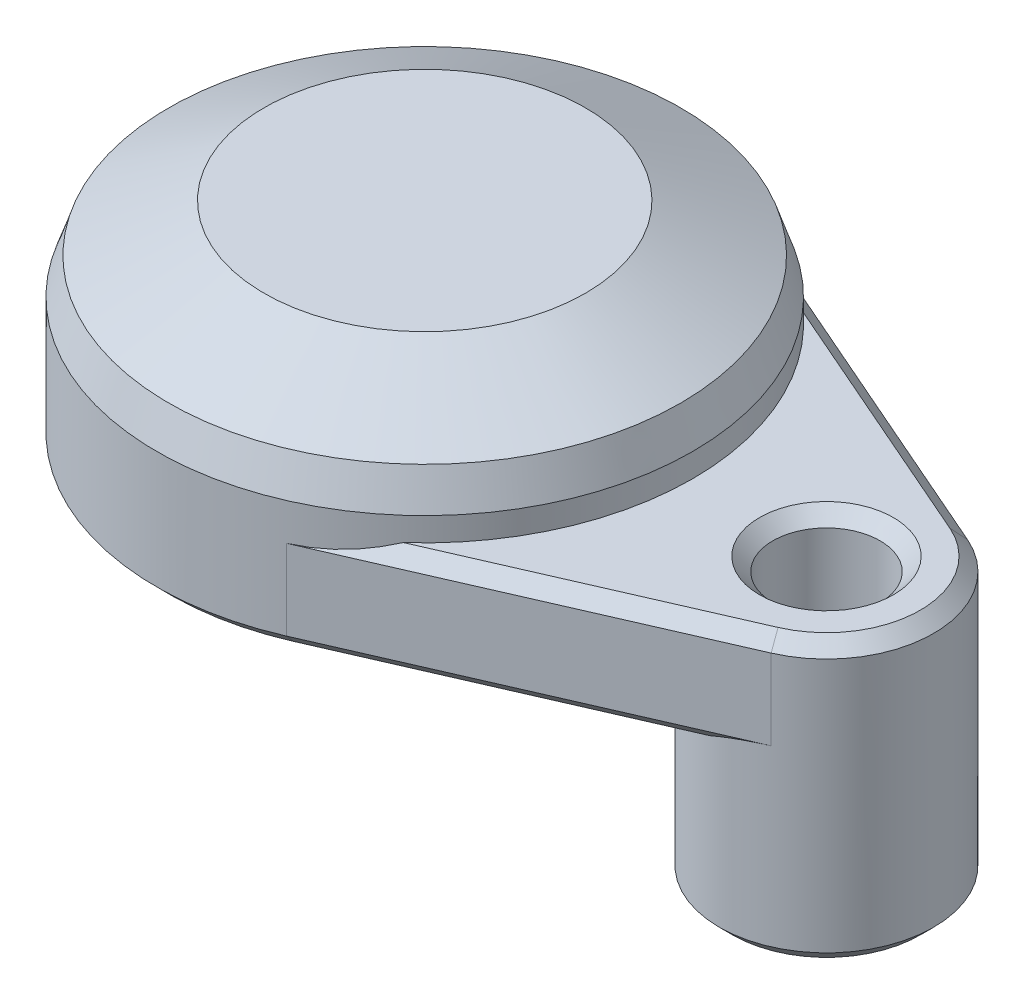
ISO-10303-21;
HEADER;
FILE_DESCRIPTION(('STEP AP214'),'2;1');
FILE_NAME('part.step','',(''),(''),'','','');
FILE_SCHEMA(('AUTOMOTIVE_DESIGN { 1 0 10303 214 1 1 1 1 }'));
ENDSEC;
DATA;
#1=APPLICATION_CONTEXT('core data for automotive mechanical design processes');
#2=APPLICATION_PROTOCOL_DEFINITION('international standard','automotive_design',2000,#1);
#3=PRODUCT_CONTEXT('',#1,'mechanical');
#4=PRODUCT('Part','Part','',(#3));
#5=PRODUCT_RELATED_PRODUCT_CATEGORY('part','',(#4));
#6=PRODUCT_DEFINITION_FORMATION('','',#4);
#7=PRODUCT_DEFINITION_CONTEXT('part definition',#1,'design');
#8=PRODUCT_DEFINITION('design','',#6,#7);
#9=PRODUCT_DEFINITION_SHAPE('','',#8);
#10=(LENGTH_UNIT() NAMED_UNIT(*) SI_UNIT(.MILLI.,.METRE.));
#11=(NAMED_UNIT(*) PLANE_ANGLE_UNIT() SI_UNIT($,.RADIAN.));
#12=(NAMED_UNIT(*) SI_UNIT($,.STERADIAN.) SOLID_ANGLE_UNIT());
#13=UNCERTAINTY_MEASURE_WITH_UNIT(LENGTH_MEASURE(1.E-05),#10,'distance_accuracy_value','');
#14=(GEOMETRIC_REPRESENTATION_CONTEXT(3) GLOBAL_UNCERTAINTY_ASSIGNED_CONTEXT((#13)) GLOBAL_UNIT_ASSIGNED_CONTEXT((#10,
#11,#12)) REPRESENTATION_CONTEXT('',''));
#15=CARTESIAN_POINT('',(0.,0.,0.));
#16=DIRECTION('',(0.,0.,1.));
#17=DIRECTION('',(1.,0.,0.));
#18=AXIS2_PLACEMENT_3D('',#15,#16,#17);
#19=CARTESIAN_POINT('',(0.,2.,0.));
#20=DIRECTION('',(0.,-1.,0.));
#21=DIRECTION('',(0.,0.,-1.));
#22=AXIS2_PLACEMENT_3D('',#19,#20,#21);
#23=CYLINDRICAL_SURFACE('',#22,5.);
#24=CARTESIAN_POINT('',(0.,2.44098300562486,0.));
#25=DIRECTION('',(0.,1.,0.));
#26=DIRECTION('',(-1.,0.,0.));
#27=AXIS2_PLACEMENT_3D('',#24,#25,#26);
#28=CIRCLE('',#27,5.);
#29=CARTESIAN_POINT('',(-5.,2.44098300562484,0.));
#30=VERTEX_POINT('',#29);
#31=EDGE_CURVE('E125',#30,#30,#28,.F.);
#32=ORIENTED_EDGE('',*,*,#31,.T.);
#33=EDGE_LOOP('',(#32));
#34=FACE_BOUND('',#33,.T.);
#35=CARTESIAN_POINT('',(0.,2.,0.));
#36=DIRECTION('',(0.,-1.,0.));
#37=DIRECTION('',(1.,0.,0.));
#38=AXIS2_PLACEMENT_3D('',#35,#36,#37);
#39=CIRCLE('',#38,5.00000000000001);
#40=CARTESIAN_POINT('',(3.33090880212542,2.00000000000001,-3.72894711036821));
#41=VERTEX_POINT('',#40);
#42=CARTESIAN_POINT('',(3.33090880212543,2.00000000000001,3.7289471103682));
#43=VERTEX_POINT('',#42);
#44=EDGE_CURVE('E126',#41,#43,#39,.T.);
#45=ORIENTED_EDGE('',*,*,#44,.F.);
#46=CARTESIAN_POINT('',(0.,6.75000000000002,0.));
#47=DIRECTION('',(0.282842712474619,0.707106781186546,-0.648074069840787));
#48=DIRECTION('',(0.282842712474618,-0.707106781186549,-0.648074069840785));
#49=AXIS2_PLACEMENT_3D('',#46,#47,#48);
#50=ELLIPSE('',#49,7.07106781186549,5.);
#51=CARTESIAN_POINT('',(2.,1.75,-4.58257569495584));
#52=VERTEX_POINT('',#51);
#53=EDGE_CURVE('E11',#41,#52,#50,.T.);
#54=ORIENTED_EDGE('',*,*,#53,.T.);
#55=DIRECTION('',(0.,-1.,0.));
#56=VECTOR('',#55,1.);
#57=CARTESIAN_POINT('',(2.,2.,-4.58257569495584));
#58=LINE('',#57,#56);
#59=CARTESIAN_POINT('',(2.,0.250000000000004,-4.58257569495584));
#60=VERTEX_POINT('',#59);
#61=EDGE_CURVE('E119',#52,#60,#58,.T.);
#62=ORIENTED_EDGE('',*,*,#61,.T.);
#63=CARTESIAN_POINT('',(0.,0.250000000000004,0.));
#64=DIRECTION('',(0.,1.,0.));
#65=DIRECTION('',(0.,0.,1.));
#66=AXIS2_PLACEMENT_3D('',#63,#64,#65);
#67=CIRCLE('',#66,5.);
#68=CARTESIAN_POINT('',(2.,0.250000000000004,4.58257569495584));
#69=VERTEX_POINT('',#68);
#70=EDGE_CURVE('E118',#60,#69,#67,.T.);
#71=ORIENTED_EDGE('',*,*,#70,.T.);
#72=DIRECTION('',(0.,-1.,0.));
#73=VECTOR('',#72,1.);
#74=CARTESIAN_POINT('',(2.,2.,4.58257569495584));
#75=LINE('',#74,#73);
#76=CARTESIAN_POINT('',(2.,1.75,4.58257569495584));
#77=VERTEX_POINT('',#76);
#78=EDGE_CURVE('E107',#77,#69,#75,.T.);
#79=ORIENTED_EDGE('',*,*,#78,.F.);
#80=CARTESIAN_POINT('',(0.,6.75,0.));
#81=DIRECTION('',(0.282842712474619,0.707106781186547,0.648074069840786));
#82=DIRECTION('',(0.282842712474619,-0.707106781186548,0.648074069840786));
#83=AXIS2_PLACEMENT_3D('',#80,#81,#82);
#84=ELLIPSE('',#83,7.07106781186547,5.);
#85=EDGE_CURVE('E51',#77,#43,#84,.T.);
#86=ORIENTED_EDGE('',*,*,#85,.T.);
#87=EDGE_LOOP('',(#45,#54,#62,#71,#79,#86));
#88=FACE_BOUND('',#87,.T.);
#89=ADVANCED_FACE('F41',(#34,#88),#23,.T.);
#90=CARTESIAN_POINT('',(2.,2.,4.58257569495584));
#91=DIRECTION('',(-0.4,0.,-0.916515138991168));
#92=DIRECTION('',(-0.916515138991168,0.,0.4));
#93=AXIS2_PLACEMENT_3D('',#90,#91,#92);
#94=PLANE('',#93);
#95=DIRECTION('',(0.,-1.,0.));
#96=VECTOR('',#95,1.);
#97=CARTESIAN_POINT('',(8.3,2.,1.83303027798234));
#98=LINE('',#97,#96);
#99=CARTESIAN_POINT('',(8.3,1.75,1.83303027798234));
#100=VERTEX_POINT('',#99);
#101=CARTESIAN_POINT('',(8.3,0.250000000000004,1.83303027798234));
#102=VERTEX_POINT('',#101);
#103=EDGE_CURVE('E115',#100,#102,#98,.T.);
#104=ORIENTED_EDGE('',*,*,#103,.F.);
#105=DIRECTION('',(-0.916515138991168,0.,0.4));
#106=VECTOR('',#105,1.);
#107=CARTESIAN_POINT('',(2.,1.75,4.58257569495584));
#108=LINE('',#107,#106);
#109=EDGE_CURVE('E65',#100,#77,#108,.T.);
#110=ORIENTED_EDGE('',*,*,#109,.T.);
#111=ORIENTED_EDGE('',*,*,#78,.T.);
#112=DIRECTION('',(0.916515138991168,0.,-0.4));
#113=VECTOR('',#112,1.);
#114=CARTESIAN_POINT('',(2.,0.250000000000004,4.58257569495584));
#115=LINE('',#114,#113);
#116=EDGE_CURVE('E111',#69,#102,#115,.T.);
#117=ORIENTED_EDGE('',*,*,#116,.T.);
#118=EDGE_LOOP('',(#104,#110,#111,#117));
#119=FACE_BOUND('',#118,.T.);
#120=ADVANCED_FACE('F109',(#119),#94,.F.);
#121=CARTESIAN_POINT('',(7.5,2.,0.));
#122=DIRECTION('',(0.,-1.,0.));
#123=DIRECTION('',(0.,0.,-1.));
#124=AXIS2_PLACEMENT_3D('',#121,#122,#123);
#125=CYLINDRICAL_SURFACE('',#124,2.);
#126=CARTESIAN_POINT('',(7.5,-3.,0.));
#127=DIRECTION('',(0.,1.,0.));
#128=DIRECTION('',(0.,0.,1.));
#129=AXIS2_PLACEMENT_3D('',#126,#127,#128);
#130=CIRCLE('',#129,2.);
#131=CARTESIAN_POINT('',(7.5,-3.,2.));
#132=VERTEX_POINT('',#131);
#133=EDGE_CURVE('E179',#132,#132,#130,.T.);
#134=ORIENTED_EDGE('',*,*,#133,.T.);
#135=EDGE_LOOP('',(#134));
#136=FACE_BOUND('',#135,.T.);
#137=DIRECTION('',(0.,-1.,0.));
#138=VECTOR('',#137,1.);
#139=CARTESIAN_POINT('',(8.3,2.,-1.83303027798234));
#140=LINE('',#139,#138);
#141=CARTESIAN_POINT('',(8.3,1.75,-1.83303027798234));
#142=VERTEX_POINT('',#141);
#143=CARTESIAN_POINT('',(8.3,0.250000000000004,-1.83303027798234));
#144=VERTEX_POINT('',#143);
#145=EDGE_CURVE('E208',#142,#144,#140,.T.);
#146=ORIENTED_EDGE('',*,*,#145,.F.);
#147=CARTESIAN_POINT('',(7.5,1.75,0.));
#148=DIRECTION('',(0.,1.,0.));
#149=DIRECTION('',(0.,0.,1.));
#150=AXIS2_PLACEMENT_3D('',#147,#148,#149);
#151=CIRCLE('',#150,2.);
#152=EDGE_CURVE('E177',#142,#100,#151,.F.);
#153=ORIENTED_EDGE('',*,*,#152,.T.);
#154=ORIENTED_EDGE('',*,*,#103,.T.);
#155=CARTESIAN_POINT('',(7.5,-1.75,0.));
#156=DIRECTION('',(-0.282842712474619,0.707106781186547,-0.648074069840786));
#157=DIRECTION('',(-0.282842712474619,-0.707106781186548,-0.648074069840786));
#158=AXIS2_PLACEMENT_3D('',#155,#156,#157);
#159=ELLIPSE('',#158,2.82842712474619,2.);
#160=CARTESIAN_POINT('',(7.31258803253505,0.,1.99119982785529));
#161=VERTEX_POINT('',#160);
#162=EDGE_CURVE('E134',#102,#161,#159,.F.);
#163=ORIENTED_EDGE('',*,*,#162,.T.);
#164=CARTESIAN_POINT('',(7.5,0.,0.));
#165=DIRECTION('',(0.,1.,0.));
#166=DIRECTION('',(0.,0.,1.));
#167=AXIS2_PLACEMENT_3D('',#164,#165,#166);
#168=CIRCLE('',#167,2.);
#169=CARTESIAN_POINT('',(7.31258803253505,0.,-1.99119982785529));
#170=VERTEX_POINT('',#169);
#171=EDGE_CURVE('E114',#170,#161,#168,.T.);
#172=ORIENTED_EDGE('',*,*,#171,.F.);
#173=CARTESIAN_POINT('',(7.5,-1.75,0.));
#174=DIRECTION('',(-0.282842712474619,0.707106781186547,0.648074069840787));
#175=DIRECTION('',(-0.282842712474619,-0.707106781186548,0.648074069840786));
#176=AXIS2_PLACEMENT_3D('',#173,#174,#175);
#177=ELLIPSE('',#176,2.82842712474619,2.);
#178=EDGE_CURVE('E135',#170,#144,#177,.F.);
#179=ORIENTED_EDGE('',*,*,#178,.T.);
#180=EDGE_LOOP('',(#146,#153,#154,#163,#172,#179));
#181=FACE_BOUND('',#180,.T.);
#182=ADVANCED_FACE('F226',(#136,#181),#125,.T.);
#183=CARTESIAN_POINT('',(8.3,2.,-1.83303027798234));
#184=DIRECTION('',(-0.4,0.,0.916515138991168));
#185=DIRECTION('',(0.916515138991168,0.,0.4));
#186=AXIS2_PLACEMENT_3D('',#183,#184,#185);
#187=PLANE('',#186);
#188=ORIENTED_EDGE('',*,*,#61,.F.);
#189=DIRECTION('',(0.916515138991168,0.,0.4));
#190=VECTOR('',#189,1.);
#191=CARTESIAN_POINT('',(8.3,1.75,-1.83303027798234));
#192=LINE('',#191,#190);
#193=EDGE_CURVE('E183',#52,#142,#192,.T.);
#194=ORIENTED_EDGE('',*,*,#193,.T.);
#195=ORIENTED_EDGE('',*,*,#145,.T.);
#196=DIRECTION('',(-0.916515138991168,0.,-0.4));
#197=VECTOR('',#196,1.);
#198=CARTESIAN_POINT('',(8.3,0.250000000000004,-1.83303027798234));
#199=LINE('',#198,#197);
#200=EDGE_CURVE('E216',#144,#60,#199,.T.);
#201=ORIENTED_EDGE('',*,*,#200,.T.);
#202=EDGE_LOOP('',(#188,#194,#195,#201));
#203=FACE_BOUND('',#202,.T.);
#204=ADVANCED_FACE('F235',(#203),#187,.F.);
#205=CARTESIAN_POINT('',(0.,2.,0.));
#206=DIRECTION('',(0.,1.,0.));
#207=DIRECTION('',(0.,0.,1.));
#208=AXIS2_PLACEMENT_3D('',#205,#206,#207);
#209=PLANE('',#208);
#210=CARTESIAN_POINT('',(7.5,2.,0.));
#211=DIRECTION('',(0.,1.,0.));
#212=DIRECTION('',(0.,0.,1.));
#213=AXIS2_PLACEMENT_3D('',#210,#211,#212);
#214=CIRCLE('',#213,1.25000000000001);
#215=CARTESIAN_POINT('',(7.5,2.,1.25000000000001));
#216=VERTEX_POINT('',#215);
#217=EDGE_CURVE('E162',#216,#216,#214,.F.);
#218=ORIENTED_EDGE('',*,*,#217,.T.);
#219=EDGE_LOOP('',(#218));
#220=FACE_BOUND('',#219,.T.);
#221=ORIENTED_EDGE('',*,*,#44,.T.);
#222=DIRECTION('',(0.916515138991168,0.,-0.4));
#223=VECTOR('',#222,1.);
#224=CARTESIAN_POINT('',(8.2,2.,1.60390149323454));
#225=LINE('',#224,#223);
#226=CARTESIAN_POINT('',(8.2,2.,1.60390149323454));
#227=VERTEX_POINT('',#226);
#228=EDGE_CURVE('E159',#43,#227,#225,.T.);
#229=ORIENTED_EDGE('',*,*,#228,.T.);
#230=CARTESIAN_POINT('',(7.5,2.,0.));
#231=DIRECTION('',(0.,1.,0.));
#232=DIRECTION('',(0.,0.,1.));
#233=AXIS2_PLACEMENT_3D('',#230,#231,#232);
#234=CIRCLE('',#233,1.75);
#235=CARTESIAN_POINT('',(8.2,2.,-1.60390149323455));
#236=VERTEX_POINT('',#235);
#237=EDGE_CURVE('E155',#227,#236,#234,.T.);
#238=ORIENTED_EDGE('',*,*,#237,.T.);
#239=DIRECTION('',(-0.916515138991168,0.,-0.4));
#240=VECTOR('',#239,1.);
#241=CARTESIAN_POINT('',(1.89999999999999,2.,-4.35344691020805));
#242=LINE('',#241,#240);
#243=EDGE_CURVE('E157',#236,#41,#242,.T.);
#244=ORIENTED_EDGE('',*,*,#243,.T.);
#245=EDGE_LOOP('',(#221,#229,#238,#244));
#246=FACE_BOUND('',#245,.T.);
#247=ADVANCED_FACE('F200',(#220,#246),#209,.T.);
#248=CARTESIAN_POINT('',(0.,0.,0.));
#249=DIRECTION('',(0.,1.,0.));
#250=DIRECTION('',(0.,0.,1.));
#251=AXIS2_PLACEMENT_3D('',#248,#249,#250);
#252=PLANE('',#251);
#253=CARTESIAN_POINT('',(0.,0.,0.));
#254=DIRECTION('',(0.,1.,0.));
#255=DIRECTION('',(0.,0.,1.));
#256=AXIS2_PLACEMENT_3D('',#253,#254,#255);
#257=CIRCLE('',#256,1.75);
#258=CARTESIAN_POINT('',(0.,0.,1.75));
#259=VERTEX_POINT('',#258);
#260=EDGE_CURVE('E165',#259,#259,#257,.T.);
#261=ORIENTED_EDGE('',*,*,#260,.T.);
#262=EDGE_LOOP('',(#261));
#263=FACE_BOUND('',#262,.T.);
#264=CARTESIAN_POINT('',(0.,0.,0.));
#265=DIRECTION('',(0.,1.,0.));
#266=DIRECTION('',(0.,0.,1.));
#267=AXIS2_PLACEMENT_3D('',#264,#265,#266);
#268=CIRCLE('',#267,4.75);
#269=CARTESIAN_POINT('',(1.9,0.,4.35344691020804));
#270=VERTEX_POINT('',#269);
#271=CARTESIAN_POINT('',(1.9,0.,-4.35344691020804));
#272=VERTEX_POINT('',#271);
#273=EDGE_CURVE('E139',#270,#272,#268,.F.);
#274=ORIENTED_EDGE('',*,*,#273,.T.);
#275=DIRECTION('',(0.916515138991168,0.,0.4));
#276=VECTOR('',#275,1.);
#277=CARTESIAN_POINT('',(1.9,0.,-4.35344691020805));
#278=LINE('',#277,#276);
#279=EDGE_CURVE('E136',#272,#170,#278,.T.);
#280=ORIENTED_EDGE('',*,*,#279,.T.);
#281=ORIENTED_EDGE('',*,*,#171,.T.);
#282=DIRECTION('',(-0.916515138991168,0.,0.4));
#283=VECTOR('',#282,1.);
#284=CARTESIAN_POINT('',(1.9,0.,4.35344691020804));
#285=LINE('',#284,#283);
#286=EDGE_CURVE('E219',#161,#270,#285,.T.);
#287=ORIENTED_EDGE('',*,*,#286,.T.);
#288=EDGE_LOOP('',(#274,#280,#281,#287));
#289=FACE_BOUND('',#288,.T.);
#290=ADVANCED_FACE('F229',(#263,#289),#252,.F.);
#291=CARTESIAN_POINT('',(7.5,-3.25,0.));
#292=DIRECTION('',(0.,1.,0.));
#293=DIRECTION('',(0.,0.,1.));
#294=AXIS2_PLACEMENT_3D('',#291,#292,#293);
#295=PLANE('',#294);
#296=CARTESIAN_POINT('',(7.5,-3.25,0.));
#297=DIRECTION('',(0.,1.,0.));
#298=DIRECTION('',(0.,0.,1.));
#299=AXIS2_PLACEMENT_3D('',#296,#297,#298);
#300=CIRCLE('',#299,1.25000000000001);
#301=CARTESIAN_POINT('',(7.5,-3.25,1.25000000000001));
#302=VERTEX_POINT('',#301);
#303=EDGE_CURVE('E174',#302,#302,#300,.T.);
#304=ORIENTED_EDGE('',*,*,#303,.T.);
#305=EDGE_LOOP('',(#304));
#306=FACE_BOUND('',#305,.T.);
#307=CARTESIAN_POINT('',(7.5,-3.25,0.));
#308=DIRECTION('',(0.,1.,0.));
#309=DIRECTION('',(0.,0.,1.));
#310=AXIS2_PLACEMENT_3D('',#307,#308,#309);
#311=CIRCLE('',#310,1.75);
#312=CARTESIAN_POINT('',(7.5,-3.25,1.75));
#313=VERTEX_POINT('',#312);
#314=EDGE_CURVE('E171',#313,#313,#311,.F.);
#315=ORIENTED_EDGE('',*,*,#314,.T.);
#316=EDGE_LOOP('',(#315));
#317=FACE_BOUND('',#316,.T.);
#318=ADVANCED_FACE('F353',(#306,#317),#295,.F.);
#319=CARTESIAN_POINT('',(7.5,-7.49264068711928,0.));
#320=DIRECTION('',(0.,1.,0.));
#321=DIRECTION('',(0.,0.,1.));
#322=AXIS2_PLACEMENT_3D('',#319,#320,#321);
#323=CYLINDRICAL_SURFACE('',#322,1.);
#324=CARTESIAN_POINT('',(7.5,1.75,0.));
#325=DIRECTION('',(0.,1.,0.));
#326=DIRECTION('',(0.,0.,1.));
#327=AXIS2_PLACEMENT_3D('',#324,#325,#326);
#328=CIRCLE('',#327,1.);
#329=CARTESIAN_POINT('',(7.5,1.75,1.));
#330=VERTEX_POINT('',#329);
#331=EDGE_CURVE('E152',#330,#330,#328,.T.);
#332=ORIENTED_EDGE('',*,*,#331,.T.);
#333=EDGE_LOOP('',(#332));
#334=FACE_BOUND('',#333,.T.);
#335=CARTESIAN_POINT('',(7.5,-3.,0.));
#336=DIRECTION('',(0.,1.,0.));
#337=DIRECTION('',(0.,0.,1.));
#338=AXIS2_PLACEMENT_3D('',#335,#336,#337);
#339=CIRCLE('',#338,1.);
#340=CARTESIAN_POINT('',(7.5,-3.,1.));
#341=VERTEX_POINT('',#340);
#342=EDGE_CURVE('E149',#341,#341,#339,.F.);
#343=ORIENTED_EDGE('',*,*,#342,.T.);
#344=EDGE_LOOP('',(#343));
#345=FACE_BOUND('',#344,.T.);
#346=ADVANCED_FACE('F345',(#334,#345),#323,.F.);
#347=CARTESIAN_POINT('',(0.,-7.49264068711928,0.));
#348=DIRECTION('',(0.,1.,0.));
#349=DIRECTION('',(0.,0.,1.));
#350=AXIS2_PLACEMENT_3D('',#347,#348,#349);
#351=CYLINDRICAL_SURFACE('',#350,1.5);
#352=CARTESIAN_POINT('',(0.,0.249999999999999,0.));
#353=DIRECTION('',(0.,1.,0.));
#354=DIRECTION('',(0.,0.,1.));
#355=AXIS2_PLACEMENT_3D('',#352,#353,#354);
#356=CIRCLE('',#355,1.5);
#357=CARTESIAN_POINT('',(0.,0.249999999999999,1.5));
#358=VERTEX_POINT('',#357);
#359=EDGE_CURVE('E168',#358,#358,#356,.F.);
#360=ORIENTED_EDGE('',*,*,#359,.T.);
#361=EDGE_LOOP('',(#360));
#362=FACE_BOUND('',#361,.T.);
#363=CARTESIAN_POINT('',(0.,2.,0.));
#364=DIRECTION('',(0.,1.,0.));
#365=DIRECTION('',(0.,0.,1.));
#366=AXIS2_PLACEMENT_3D('',#363,#364,#365);
#367=CIRCLE('',#366,1.5);
#368=CARTESIAN_POINT('',(0.,2.,1.5));
#369=VERTEX_POINT('',#368);
#370=EDGE_CURVE('E144',#369,#369,#367,.T.);
#371=ORIENTED_EDGE('',*,*,#370,.T.);
#372=EDGE_LOOP('',(#371));
#373=FACE_BOUND('',#372,.T.);
#374=ADVANCED_FACE('F340',(#362,#373),#351,.F.);
#375=CARTESIAN_POINT('',(3.,4.00000000000001,0.));
#376=DIRECTION('',(0.,1.,0.));
#377=DIRECTION('',(-1.,0.,0.));
#378=AXIS2_PLACEMENT_3D('',#375,#376,#377);
#379=PLANE('',#378);
#380=CARTESIAN_POINT('',(0.,4.,0.));
#381=DIRECTION('',(0.,-1.,0.));
#382=DIRECTION('',(1.,0.,0.));
#383=AXIS2_PLACEMENT_3D('',#380,#381,#382);
#384=CIRCLE('',#383,3.00000000000001);
#385=CARTESIAN_POINT('',(3.,4.00000000000001,0.));
#386=VERTEX_POINT('',#385);
#387=EDGE_CURVE('E140',#386,#386,#384,.T.);
#388=ORIENTED_EDGE('',*,*,#387,.F.);
#389=EDGE_LOOP('',(#388));
#390=FACE_BOUND('',#389,.T.);
#391=ADVANCED_FACE('F344',(#390),#379,.T.);
#392=CARTESIAN_POINT('',(0.,2.99999999999989,0.));
#393=DIRECTION('',(0.,-1.,0.));
#394=DIRECTION('',(1.,0.,0.));
#395=AXIS2_PLACEMENT_3D('',#392,#393,#394);
#396=CONICAL_SURFACE('',#395,5.00000000000001,1.10714871779405);
#397=CARTESIAN_POINT('',(0.,3.1118033988749,0.));
#398=DIRECTION('',(0.,-1.,0.));
#399=DIRECTION('',(1.,0.,0.));
#400=AXIS2_PLACEMENT_3D('',#397,#398,#399);
#401=CIRCLE('',#400,4.77639320225003);
#402=CARTESIAN_POINT('',(4.77639320225002,3.11180339887491,0.));
#403=VERTEX_POINT('',#402);
#404=EDGE_CURVE('E213',#403,#403,#401,.F.);
#405=ORIENTED_EDGE('',*,*,#404,.T.);
#406=EDGE_LOOP('',(#405));
#407=FACE_BOUND('',#406,.T.);
#408=ORIENTED_EDGE('',*,*,#387,.T.);
#409=EDGE_LOOP('',(#408));
#410=FACE_BOUND('',#409,.T.);
#411=ADVANCED_FACE('F396',(#407,#410),#396,.T.);
#412=CARTESIAN_POINT('',(0.,1.99999999999999,0.));
#413=DIRECTION('',(0.,-1.,0.));
#414=DIRECTION('',(1.,0.,0.));
#415=AXIS2_PLACEMENT_3D('',#412,#413,#414);
#416=PLANE('',#415);
#417=ORIENTED_EDGE('',*,*,#370,.F.);
#418=EDGE_LOOP('',(#417));
#419=FACE_BOUND('',#418,.T.);
#420=ADVANCED_FACE('F263',(#419),#416,.T.);
#421=CARTESIAN_POINT('',(0.,2.44098300562488,0.));
#422=DIRECTION('',(0.,-1.,0.));
#423=DIRECTION('',(1.,0.,0.));
#424=AXIS2_PLACEMENT_3D('',#421,#422,#423);
#425=CONICAL_SURFACE('',#424,5.,0.321750554396597);
#426=ORIENTED_EDGE('',*,*,#404,.F.);
#427=EDGE_LOOP('',(#426));
#428=FACE_BOUND('',#427,.T.);
#429=ORIENTED_EDGE('',*,*,#31,.F.);
#430=EDGE_LOOP('',(#429));
#431=FACE_BOUND('',#430,.T.);
#432=ADVANCED_FACE('F257',(#428,#431),#425,.T.);
#433=CARTESIAN_POINT('',(2.,0.250000000000004,4.58257569495584));
#434=DIRECTION('',(-0.282842712474619,0.707106781186547,-0.648074069840786));
#435=DIRECTION('',(0.916515138991168,0.,-0.4));
#436=AXIS2_PLACEMENT_3D('',#433,#434,#435);
#437=PLANE('',#436);
#438=ORIENTED_EDGE('',*,*,#162,.F.);
#439=ORIENTED_EDGE('',*,*,#116,.F.);
#440=DIRECTION('',(0.282842712474619,0.707106781186549,0.648074069840785));
#441=VECTOR('',#440,1.);
#442=CARTESIAN_POINT('',(1.9,0.,4.35344691020804));
#443=LINE('',#442,#441);
#444=EDGE_CURVE('E132',#270,#69,#443,.T.);
#445=ORIENTED_EDGE('',*,*,#444,.F.);
#446=ORIENTED_EDGE('',*,*,#286,.F.);
#447=EDGE_LOOP('',(#438,#439,#445,#446));
#448=FACE_BOUND('',#447,.T.);
#449=ADVANCED_FACE('F130',(#448),#437,.F.);
#450=CARTESIAN_POINT('',(0.,0.250000000000004,0.));
#451=DIRECTION('',(0.,1.,0.));
#452=DIRECTION('',(0.,0.,1.));
#453=AXIS2_PLACEMENT_3D('',#450,#451,#452);
#454=CONICAL_SURFACE('',#453,5.,0.785398163397448);
#455=ORIENTED_EDGE('',*,*,#444,.T.);
#456=ORIENTED_EDGE('',*,*,#70,.F.);
#457=DIRECTION('',(0.282842712474619,0.707106781186547,-0.648074069840787));
#458=VECTOR('',#457,1.);
#459=CARTESIAN_POINT('',(1.9,0.,-4.35344691020804));
#460=LINE('',#459,#458);
#461=EDGE_CURVE('E141',#272,#60,#460,.T.);
#462=ORIENTED_EDGE('',*,*,#461,.F.);
#463=ORIENTED_EDGE('',*,*,#273,.F.);
#464=EDGE_LOOP('',(#455,#456,#462,#463));
#465=FACE_BOUND('',#464,.T.);
#466=ADVANCED_FACE('F138',(#465),#454,.T.);
#467=CARTESIAN_POINT('',(8.3,0.250000000000004,-1.83303027798234));
#468=DIRECTION('',(-0.282842712474619,0.707106781186547,0.648074069840787));
#469=DIRECTION('',(-0.916515138991168,0.,-0.4));
#470=AXIS2_PLACEMENT_3D('',#467,#468,#469);
#471=PLANE('',#470);
#472=ORIENTED_EDGE('',*,*,#178,.F.);
#473=ORIENTED_EDGE('',*,*,#279,.F.);
#474=ORIENTED_EDGE('',*,*,#461,.T.);
#475=ORIENTED_EDGE('',*,*,#200,.F.);
#476=EDGE_LOOP('',(#472,#473,#474,#475));
#477=FACE_BOUND('',#476,.T.);
#478=ADVANCED_FACE('F232',(#477),#471,.F.);
#479=CARTESIAN_POINT('',(7.5,1.75,0.));
#480=DIRECTION('',(0.,1.,0.));
#481=DIRECTION('',(0.,0.,1.));
#482=AXIS2_PLACEMENT_3D('',#479,#480,#481);
#483=CONICAL_SURFACE('',#482,1.,0.78539816339745);
#484=ORIENTED_EDGE('',*,*,#217,.F.);
#485=EDGE_LOOP('',(#484));
#486=FACE_BOUND('',#485,.T.);
#487=ORIENTED_EDGE('',*,*,#331,.F.);
#488=EDGE_LOOP('',(#487));
#489=FACE_BOUND('',#488,.T.);
#490=ADVANCED_FACE('F271',(#486,#489),#483,.F.);
#491=CARTESIAN_POINT('',(0.,0.,0.));
#492=DIRECTION('',(0.,-1.,0.));
#493=DIRECTION('',(0.,0.,-1.));
#494=AXIS2_PLACEMENT_3D('',#491,#492,#493);
#495=CONICAL_SURFACE('',#494,1.75,0.785398163397445);
#496=ORIENTED_EDGE('',*,*,#359,.F.);
#497=EDGE_LOOP('',(#496));
#498=FACE_BOUND('',#497,.T.);
#499=ORIENTED_EDGE('',*,*,#260,.F.);
#500=EDGE_LOOP('',(#499));
#501=FACE_BOUND('',#500,.T.);
#502=ADVANCED_FACE('F285',(#498,#501),#495,.F.);
#503=CARTESIAN_POINT('',(7.5,-3.,0.));
#504=DIRECTION('',(0.,-1.,0.));
#505=DIRECTION('',(0.,0.,-1.));
#506=AXIS2_PLACEMENT_3D('',#503,#504,#505);
#507=CONICAL_SURFACE('',#506,1.,0.78539816339745);
#508=ORIENTED_EDGE('',*,*,#303,.F.);
#509=EDGE_LOOP('',(#508));
#510=FACE_BOUND('',#509,.T.);
#511=ORIENTED_EDGE('',*,*,#342,.F.);
#512=EDGE_LOOP('',(#511));
#513=FACE_BOUND('',#512,.T.);
#514=ADVANCED_FACE('F292',(#510,#513),#507,.F.);
#515=CARTESIAN_POINT('',(7.5,-3.,0.));
#516=DIRECTION('',(0.,1.,0.));
#517=DIRECTION('',(0.,0.,1.));
#518=AXIS2_PLACEMENT_3D('',#515,#516,#517);
#519=CONICAL_SURFACE('',#518,2.,0.78539816339745);
#520=ORIENTED_EDGE('',*,*,#314,.F.);
#521=EDGE_LOOP('',(#520));
#522=FACE_BOUND('',#521,.T.);
#523=ORIENTED_EDGE('',*,*,#133,.F.);
#524=EDGE_LOOP('',(#523));
#525=FACE_BOUND('',#524,.T.);
#526=ADVANCED_FACE('F299',(#522,#525),#519,.T.);
#527=CARTESIAN_POINT('',(1.9,2.,-4.35344691020805));
#528=DIRECTION('',(0.282842712474619,0.707106781186546,-0.648074069840787));
#529=DIRECTION('',(0.916515138991168,0.,0.4));
#530=AXIS2_PLACEMENT_3D('',#527,#528,#529);
#531=PLANE('',#530);
#532=ORIENTED_EDGE('',*,*,#53,.F.);
#533=ORIENTED_EDGE('',*,*,#243,.F.);
#534=DIRECTION('',(-0.282842712474617,0.707106781186549,0.648074069840785));
#535=VECTOR('',#534,1.);
#536=CARTESIAN_POINT('',(8.3,1.75,-1.83303027798234));
#537=LINE('',#536,#535);
#538=EDGE_CURVE('E46',#142,#236,#537,.T.);
#539=ORIENTED_EDGE('',*,*,#538,.F.);
#540=ORIENTED_EDGE('',*,*,#193,.F.);
#541=EDGE_LOOP('',(#532,#533,#539,#540));
#542=FACE_BOUND('',#541,.T.);
#543=ADVANCED_FACE('F44',(#542),#531,.T.);
#544=CARTESIAN_POINT('',(7.5,2.,0.));
#545=DIRECTION('',(0.,-1.,0.));
#546=DIRECTION('',(0.,0.,-1.));
#547=AXIS2_PLACEMENT_3D('',#544,#545,#546);
#548=CONICAL_SURFACE('',#547,1.75,0.785398163397447);
#549=ORIENTED_EDGE('',*,*,#538,.T.);
#550=ORIENTED_EDGE('',*,*,#237,.F.);
#551=DIRECTION('',(-0.282842712474617,0.707106781186549,-0.648074069840785));
#552=VECTOR('',#551,1.);
#553=CARTESIAN_POINT('',(8.3,1.75,1.83303027798234));
#554=LINE('',#553,#552);
#555=EDGE_CURVE('E185',#100,#227,#554,.T.);
#556=ORIENTED_EDGE('',*,*,#555,.F.);
#557=ORIENTED_EDGE('',*,*,#152,.F.);
#558=EDGE_LOOP('',(#549,#550,#556,#557));
#559=FACE_BOUND('',#558,.T.);
#560=ADVANCED_FACE('F194',(#559),#548,.T.);
#561=CARTESIAN_POINT('',(1.9,2.,4.35344691020805));
#562=DIRECTION('',(0.282842712474619,0.707106781186547,0.648074069840786));
#563=DIRECTION('',(-0.916515138991168,0.,0.4));
#564=AXIS2_PLACEMENT_3D('',#561,#562,#563);
#565=PLANE('',#564);
#566=ORIENTED_EDGE('',*,*,#85,.F.);
#567=ORIENTED_EDGE('',*,*,#109,.F.);
#568=ORIENTED_EDGE('',*,*,#555,.T.);
#569=ORIENTED_EDGE('',*,*,#228,.F.);
#570=EDGE_LOOP('',(#566,#567,#568,#569));
#571=FACE_BOUND('',#570,.T.);
#572=ADVANCED_FACE('F307',(#571),#565,.T.);
#573=CLOSED_SHELL('',(#89,#120,#182,#204,#247,#290,#318,#346,#374,#391,#411,#420,#432,#449,#466,
#478,#490,#502,#514,#526,#543,#560,#572));
#574=MANIFOLD_SOLID_BREP('B2',#573);
#575=ADVANCED_BREP_SHAPE_REPRESENTATION('',(#18,#574),#14);
#576=SHAPE_DEFINITION_REPRESENTATION(#9,#575);
ENDSEC;
END-ISO-10303-21;
